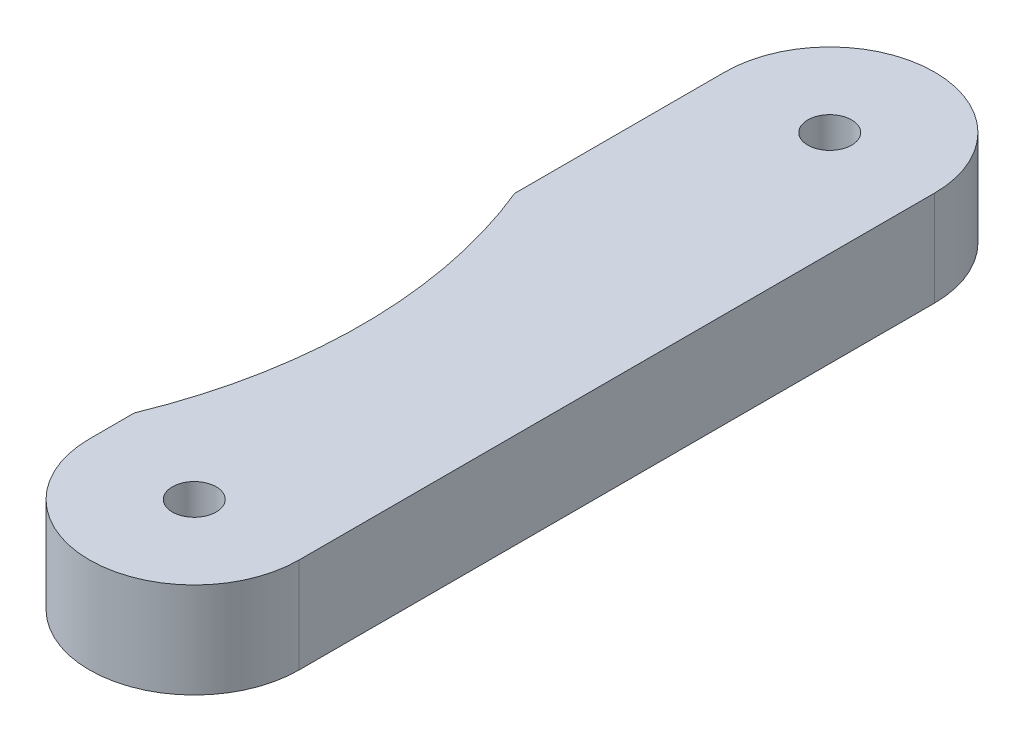
ISO-10303-21;
HEADER;
FILE_DESCRIPTION(('STEP AP214'),'2;1');
FILE_NAME('part.step','',(''),(''),'','','');
FILE_SCHEMA(('AUTOMOTIVE_DESIGN { 1 0 10303 214 1 1 1 1 }'));
ENDSEC;
DATA;
#1=APPLICATION_CONTEXT('core data for automotive mechanical design processes');
#2=APPLICATION_PROTOCOL_DEFINITION('international standard','automotive_design',2000,#1);
#3=PRODUCT_CONTEXT('',#1,'mechanical');
#4=PRODUCT('Part','Part','',(#3));
#5=PRODUCT_RELATED_PRODUCT_CATEGORY('part','',(#4));
#6=PRODUCT_DEFINITION_FORMATION('','',#4);
#7=PRODUCT_DEFINITION_CONTEXT('part definition',#1,'design');
#8=PRODUCT_DEFINITION('design','',#6,#7);
#9=PRODUCT_DEFINITION_SHAPE('','',#8);
#10=(LENGTH_UNIT() NAMED_UNIT(*) SI_UNIT(.MILLI.,.METRE.));
#11=(NAMED_UNIT(*) PLANE_ANGLE_UNIT() SI_UNIT($,.RADIAN.));
#12=(NAMED_UNIT(*) SI_UNIT($,.STERADIAN.) SOLID_ANGLE_UNIT());
#13=UNCERTAINTY_MEASURE_WITH_UNIT(LENGTH_MEASURE(1.E-05),#10,'distance_accuracy_value','');
#14=(GEOMETRIC_REPRESENTATION_CONTEXT(3) GLOBAL_UNCERTAINTY_ASSIGNED_CONTEXT((#13)) GLOBAL_UNIT_ASSIGNED_CONTEXT((#10,
#11,#12)) REPRESENTATION_CONTEXT('',''));
#15=CARTESIAN_POINT('',(0.,0.,0.));
#16=DIRECTION('',(0.,0.,1.));
#17=DIRECTION('',(1.,0.,0.));
#18=AXIS2_PLACEMENT_3D('',#15,#16,#17);
#19=CARTESIAN_POINT('',(0.30765517241379,3.81,-6.51724137931036));
#20=DIRECTION('',(1.,0.,0.));
#21=DIRECTION('',(0.,0.,-1.));
#22=AXIS2_PLACEMENT_3D('',#19,#20,#21);
#23=PLANE('',#22);
#24=DIRECTION('',(0.,0.,1.));
#25=VECTOR('',#24,1.);
#26=CARTESIAN_POINT('',(0.30765517241379,0.,-6.51724137931036));
#27=LINE('',#26,#25);
#28=CARTESIAN_POINT('',(0.30765517241379,0.,-6.51724137931036));
#29=VERTEX_POINT('',#28);
#30=CARTESIAN_POINT('',(0.307655172413791,0.,1.8854165439043));
#31=VERTEX_POINT('',#30);
#32=EDGE_CURVE('E127',#29,#31,#27,.T.);
#33=ORIENTED_EDGE('',*,*,#32,.T.);
#34=DIRECTION('',(0.,1.,0.));
#35=VECTOR('',#34,1.);
#36=CARTESIAN_POINT('',(0.307655172413789,0.,1.8854165439043));
#37=LINE('',#36,#35);
#38=CARTESIAN_POINT('',(0.307655172413789,3.81,1.8854165439043));
#39=VERTEX_POINT('',#38);
#40=EDGE_CURVE('E57',#31,#39,#37,.T.);
#41=ORIENTED_EDGE('',*,*,#40,.T.);
#42=DIRECTION('',(0.,0.,1.));
#43=VECTOR('',#42,1.);
#44=CARTESIAN_POINT('',(0.30765517241379,3.81,-6.51724137931036));
#45=LINE('',#44,#43);
#46=CARTESIAN_POINT('',(0.30765517241379,3.81,-6.51724137931036));
#47=VERTEX_POINT('',#46);
#48=EDGE_CURVE('E93',#47,#39,#45,.T.);
#49=ORIENTED_EDGE('',*,*,#48,.F.);
#50=DIRECTION('',(0.,-1.,0.));
#51=VECTOR('',#50,1.);
#52=CARTESIAN_POINT('',(0.30765517241379,3.81,-6.51724137931036));
#53=LINE('',#52,#51);
#54=EDGE_CURVE('E11',#47,#29,#53,.T.);
#55=ORIENTED_EDGE('',*,*,#54,.T.);
#56=EDGE_LOOP('',(#33,#41,#49,#55));
#57=FACE_BOUND('',#56,.T.);
#58=ADVANCED_FACE('F41',(#57),#23,.F.);
#59=CARTESIAN_POINT('',(4.49865517241379,3.81,-6.51724137931036));
#60=DIRECTION('',(0.,-1.,0.));
#61=DIRECTION('',(0.,0.,-1.));
#62=AXIS2_PLACEMENT_3D('',#59,#60,#61);
#63=CYLINDRICAL_SURFACE('',#62,4.191);
#64=CARTESIAN_POINT('',(4.49865517241379,0.,-6.51724137931036));
#65=DIRECTION('',(0.,1.,0.));
#66=DIRECTION('',(0.,0.,-1.));
#67=AXIS2_PLACEMENT_3D('',#64,#65,#66);
#68=CIRCLE('',#67,4.191);
#69=CARTESIAN_POINT('',(8.68965517241379,0.,-6.51724137931035));
#70=VERTEX_POINT('',#69);
#71=EDGE_CURVE('E128',#70,#29,#68,.T.);
#72=ORIENTED_EDGE('',*,*,#71,.T.);
#73=ORIENTED_EDGE('',*,*,#54,.F.);
#74=CARTESIAN_POINT('',(4.49865517241379,3.81,-6.51724137931036));
#75=DIRECTION('',(0.,1.,0.));
#76=DIRECTION('',(0.,0.,-1.));
#77=AXIS2_PLACEMENT_3D('',#74,#75,#76);
#78=CIRCLE('',#77,4.191);
#79=CARTESIAN_POINT('',(8.68965517241379,3.81,-6.51724137931035));
#80=VERTEX_POINT('',#79);
#81=EDGE_CURVE('E141',#80,#47,#78,.T.);
#82=ORIENTED_EDGE('',*,*,#81,.F.);
#83=DIRECTION('',(0.,-1.,0.));
#84=VECTOR('',#83,1.);
#85=CARTESIAN_POINT('',(8.68965517241379,3.81,-6.51724137931035));
#86=LINE('',#85,#84);
#87=EDGE_CURVE('E142',#80,#70,#86,.T.);
#88=ORIENTED_EDGE('',*,*,#87,.T.);
#89=EDGE_LOOP('',(#72,#73,#82,#88));
#90=FACE_BOUND('',#89,.T.);
#91=ADVANCED_FACE('F43',(#90),#63,.T.);
#92=CARTESIAN_POINT('',(0.307655172413789,3.81,17.084100697475));
#93=VERTEX_POINT('',#92);
#94=CARTESIAN_POINT('',(0.307655172413793,3.81,18.8827586206896));
#95=VERTEX_POINT('',#94);
#96=EDGE_CURVE('E118',#93,#95,#45,.T.);
#97=ORIENTED_EDGE('',*,*,#96,.F.);
#98=DIRECTION('',(0.,1.,0.));
#99=VECTOR('',#98,1.);
#100=CARTESIAN_POINT('',(0.307655172413789,0.,17.084100697475));
#101=LINE('',#100,#99);
#102=CARTESIAN_POINT('',(0.307655172413789,0.,17.084100697475));
#103=VERTEX_POINT('',#102);
#104=EDGE_CURVE('E104',#103,#93,#101,.T.);
#105=ORIENTED_EDGE('',*,*,#104,.F.);
#106=CARTESIAN_POINT('',(0.307655172413793,0.,18.8827586206896));
#107=VERTEX_POINT('',#106);
#108=EDGE_CURVE('E116',#103,#107,#27,.T.);
#109=ORIENTED_EDGE('',*,*,#108,.T.);
#110=DIRECTION('',(0.,-1.,0.));
#111=VECTOR('',#110,1.);
#112=CARTESIAN_POINT('',(0.307655172413793,3.81,18.8827586206896));
#113=LINE('',#112,#111);
#114=EDGE_CURVE('E50',#95,#107,#113,.T.);
#115=ORIENTED_EDGE('',*,*,#114,.F.);
#116=EDGE_LOOP('',(#97,#105,#109,#115));
#117=FACE_BOUND('',#116,.T.);
#118=ADVANCED_FACE('F114',(#117),#23,.F.);
#119=CARTESIAN_POINT('',(4.49865517241379,3.81,18.8827586206896));
#120=DIRECTION('',(0.,-1.,0.));
#121=DIRECTION('',(0.,0.,-1.));
#122=AXIS2_PLACEMENT_3D('',#119,#120,#121);
#123=CYLINDRICAL_SURFACE('',#122,4.191);
#124=CARTESIAN_POINT('',(4.49865517241379,0.,18.8827586206896));
#125=DIRECTION('',(0.,1.,0.));
#126=DIRECTION('',(0.,0.,-1.));
#127=AXIS2_PLACEMENT_3D('',#124,#125,#126);
#128=CIRCLE('',#127,4.191);
#129=CARTESIAN_POINT('',(8.68965517241379,0.,18.8827586206896));
#130=VERTEX_POINT('',#129);
#131=EDGE_CURVE('E125',#107,#130,#128,.T.);
#132=ORIENTED_EDGE('',*,*,#131,.T.);
#133=DIRECTION('',(0.,-1.,0.));
#134=VECTOR('',#133,1.);
#135=CARTESIAN_POINT('',(8.68965517241379,3.81,18.8827586206896));
#136=LINE('',#135,#134);
#137=CARTESIAN_POINT('',(8.68965517241379,3.81,18.8827586206896));
#138=VERTEX_POINT('',#137);
#139=EDGE_CURVE('E145',#138,#130,#136,.T.);
#140=ORIENTED_EDGE('',*,*,#139,.F.);
#141=CARTESIAN_POINT('',(4.49865517241379,3.81,18.8827586206896));
#142=DIRECTION('',(0.,1.,0.));
#143=DIRECTION('',(0.,0.,-1.));
#144=AXIS2_PLACEMENT_3D('',#141,#142,#143);
#145=CIRCLE('',#144,4.191);
#146=EDGE_CURVE('E152',#95,#138,#145,.T.);
#147=ORIENTED_EDGE('',*,*,#146,.F.);
#148=ORIENTED_EDGE('',*,*,#114,.T.);
#149=EDGE_LOOP('',(#132,#140,#147,#148));
#150=FACE_BOUND('',#149,.T.);
#151=ADVANCED_FACE('F150',(#150),#123,.T.);
#152=CARTESIAN_POINT('',(8.68965517241379,3.81,-6.51724137931035));
#153=DIRECTION('',(-1.,0.,0.));
#154=DIRECTION('',(0.,0.,1.));
#155=AXIS2_PLACEMENT_3D('',#152,#153,#154);
#156=PLANE('',#155);
#157=DIRECTION('',(0.,0.,-1.));
#158=VECTOR('',#157,1.);
#159=CARTESIAN_POINT('',(8.68965517241379,0.,-6.51724137931035));
#160=LINE('',#159,#158);
#161=EDGE_CURVE('E87',#130,#70,#160,.T.);
#162=ORIENTED_EDGE('',*,*,#161,.T.);
#163=ORIENTED_EDGE('',*,*,#87,.F.);
#164=DIRECTION('',(0.,0.,-1.));
#165=VECTOR('',#164,1.);
#166=CARTESIAN_POINT('',(8.68965517241379,3.81,-6.51724137931035));
#167=LINE('',#166,#165);
#168=EDGE_CURVE('E66',#138,#80,#167,.T.);
#169=ORIENTED_EDGE('',*,*,#168,.F.);
#170=ORIENTED_EDGE('',*,*,#139,.T.);
#171=EDGE_LOOP('',(#162,#163,#169,#170));
#172=FACE_BOUND('',#171,.T.);
#173=ADVANCED_FACE('F183',(#172),#156,.F.);
#174=CARTESIAN_POINT('',(4.49865517241379,3.81,-6.51724137931036));
#175=DIRECTION('',(0.,-1.,0.));
#176=DIRECTION('',(0.,0.,-1.));
#177=AXIS2_PLACEMENT_3D('',#174,#175,#176);
#178=PLANE('',#177);
#179=CARTESIAN_POINT('',(4.49865517241379,3.81,-6.51724137931036));
#180=DIRECTION('',(0.,1.,0.));
#181=DIRECTION('',(0.,0.,1.));
#182=AXIS2_PLACEMENT_3D('',#179,#180,#181);
#183=CIRCLE('',#182,0.8763);
#184=CARTESIAN_POINT('',(4.49865517241379,3.81,-5.64094137931036));
#185=VERTEX_POINT('',#184);
#186=EDGE_CURVE('E120',#185,#185,#183,.T.);
#187=ORIENTED_EDGE('',*,*,#186,.F.);
#188=EDGE_LOOP('',(#187));
#189=FACE_BOUND('',#188,.T.);
#190=CARTESIAN_POINT('',(4.49865517241379,3.81,18.8827586206896));
#191=DIRECTION('',(0.,1.,0.));
#192=DIRECTION('',(0.,0.,1.));
#193=AXIS2_PLACEMENT_3D('',#190,#191,#192);
#194=CIRCLE('',#193,0.876299999999999);
#195=CARTESIAN_POINT('',(4.49865517241379,3.81,19.7590586206896));
#196=VERTEX_POINT('',#195);
#197=EDGE_CURVE('E164',#196,#196,#194,.T.);
#198=ORIENTED_EDGE('',*,*,#197,.F.);
#199=EDGE_LOOP('',(#198));
#200=FACE_BOUND('',#199,.T.);
#201=ORIENTED_EDGE('',*,*,#48,.T.);
#202=CARTESIAN_POINT('',(-18.1923448275862,3.81,9.48475862068965));
#203=DIRECTION('',(0.,1.,0.));
#204=DIRECTION('',(0.,0.,1.));
#205=AXIS2_PLACEMENT_3D('',#202,#203,#204);
#206=CIRCLE('',#205,20.);
#207=EDGE_CURVE('E110',#93,#39,#206,.T.);
#208=ORIENTED_EDGE('',*,*,#207,.F.);
#209=ORIENTED_EDGE('',*,*,#96,.T.);
#210=ORIENTED_EDGE('',*,*,#146,.T.);
#211=ORIENTED_EDGE('',*,*,#168,.T.);
#212=ORIENTED_EDGE('',*,*,#81,.T.);
#213=EDGE_LOOP('',(#201,#208,#209,#210,#211,#212));
#214=FACE_BOUND('',#213,.T.);
#215=ADVANCED_FACE('F178',(#189,#200,#214),#178,.F.);
#216=CARTESIAN_POINT('',(4.49865517241379,0.,-6.51724137931036));
#217=DIRECTION('',(0.,-1.,0.));
#218=DIRECTION('',(0.,0.,-1.));
#219=AXIS2_PLACEMENT_3D('',#216,#217,#218);
#220=PLANE('',#219);
#221=CARTESIAN_POINT('',(-18.1923448275862,0.,9.48475862068965));
#222=DIRECTION('',(0.,1.,0.));
#223=DIRECTION('',(0.,0.,1.));
#224=AXIS2_PLACEMENT_3D('',#221,#222,#223);
#225=CIRCLE('',#224,20.);
#226=EDGE_CURVE('E101',#103,#31,#225,.T.);
#227=ORIENTED_EDGE('',*,*,#226,.T.);
#228=ORIENTED_EDGE('',*,*,#32,.F.);
#229=ORIENTED_EDGE('',*,*,#71,.F.);
#230=ORIENTED_EDGE('',*,*,#161,.F.);
#231=ORIENTED_EDGE('',*,*,#131,.F.);
#232=ORIENTED_EDGE('',*,*,#108,.F.);
#233=EDGE_LOOP('',(#227,#228,#229,#230,#231,#232));
#234=FACE_BOUND('',#233,.T.);
#235=CARTESIAN_POINT('',(4.49865517241379,0.,-6.51724137931036));
#236=DIRECTION('',(0.,1.,0.));
#237=DIRECTION('',(0.,0.,1.));
#238=AXIS2_PLACEMENT_3D('',#235,#236,#237);
#239=CIRCLE('',#238,0.876299999999999);
#240=CARTESIAN_POINT('',(4.49865517241379,0.,-5.64094137931036));
#241=VERTEX_POINT('',#240);
#242=EDGE_CURVE('E168',#241,#241,#239,.T.);
#243=ORIENTED_EDGE('',*,*,#242,.T.);
#244=EDGE_LOOP('',(#243));
#245=FACE_BOUND('',#244,.T.);
#246=CARTESIAN_POINT('',(4.49865517241379,0.,18.8827586206896));
#247=DIRECTION('',(0.,1.,0.));
#248=DIRECTION('',(0.,0.,1.));
#249=AXIS2_PLACEMENT_3D('',#246,#247,#248);
#250=CIRCLE('',#249,0.876299999999999);
#251=CARTESIAN_POINT('',(4.49865517241379,0.,19.7590586206896));
#252=VERTEX_POINT('',#251);
#253=EDGE_CURVE('E133',#252,#252,#250,.T.);
#254=ORIENTED_EDGE('',*,*,#253,.T.);
#255=EDGE_LOOP('',(#254));
#256=FACE_BOUND('',#255,.T.);
#257=ADVANCED_FACE('F123',(#234,#245,#256),#220,.T.);
#258=CARTESIAN_POINT('',(4.49865517241379,3.81,18.8827586206896));
#259=DIRECTION('',(0.,1.,0.));
#260=DIRECTION('',(0.,0.,1.));
#261=AXIS2_PLACEMENT_3D('',#258,#259,#260);
#262=CYLINDRICAL_SURFACE('',#261,0.876299999999999);
#263=ORIENTED_EDGE('',*,*,#253,.F.);
#264=EDGE_LOOP('',(#263));
#265=FACE_BOUND('',#264,.T.);
#266=ORIENTED_EDGE('',*,*,#197,.T.);
#267=EDGE_LOOP('',(#266));
#268=FACE_BOUND('',#267,.T.);
#269=ADVANCED_FACE('F220',(#265,#268),#262,.F.);
#270=CARTESIAN_POINT('',(4.49865517241379,3.81,-6.51724137931036));
#271=DIRECTION('',(0.,1.,0.));
#272=DIRECTION('',(0.,0.,1.));
#273=AXIS2_PLACEMENT_3D('',#270,#271,#272);
#274=CYLINDRICAL_SURFACE('',#273,0.8763);
#275=ORIENTED_EDGE('',*,*,#242,.F.);
#276=EDGE_LOOP('',(#275));
#277=FACE_BOUND('',#276,.T.);
#278=ORIENTED_EDGE('',*,*,#186,.T.);
#279=EDGE_LOOP('',(#278));
#280=FACE_BOUND('',#279,.T.);
#281=ADVANCED_FACE('F226',(#277,#280),#274,.F.);
#282=CARTESIAN_POINT('',(-18.1923448275862,0.,9.48475862068965));
#283=DIRECTION('',(0.,1.,0.));
#284=DIRECTION('',(0.,0.,1.));
#285=AXIS2_PLACEMENT_3D('',#282,#283,#284);
#286=CYLINDRICAL_SURFACE('',#285,20.);
#287=ORIENTED_EDGE('',*,*,#207,.T.);
#288=ORIENTED_EDGE('',*,*,#40,.F.);
#289=ORIENTED_EDGE('',*,*,#226,.F.);
#290=ORIENTED_EDGE('',*,*,#104,.T.);
#291=EDGE_LOOP('',(#287,#288,#289,#290));
#292=FACE_BOUND('',#291,.T.);
#293=ADVANCED_FACE('F103',(#292),#286,.F.);
#294=CLOSED_SHELL('',(#58,#91,#118,#151,#173,#215,#257,#269,#281,#293));
#295=MANIFOLD_SOLID_BREP('B2',#294);
#296=ADVANCED_BREP_SHAPE_REPRESENTATION('',(#18,#295),#14);
#297=SHAPE_DEFINITION_REPRESENTATION(#9,#296);
ENDSEC;
END-ISO-10303-21;
